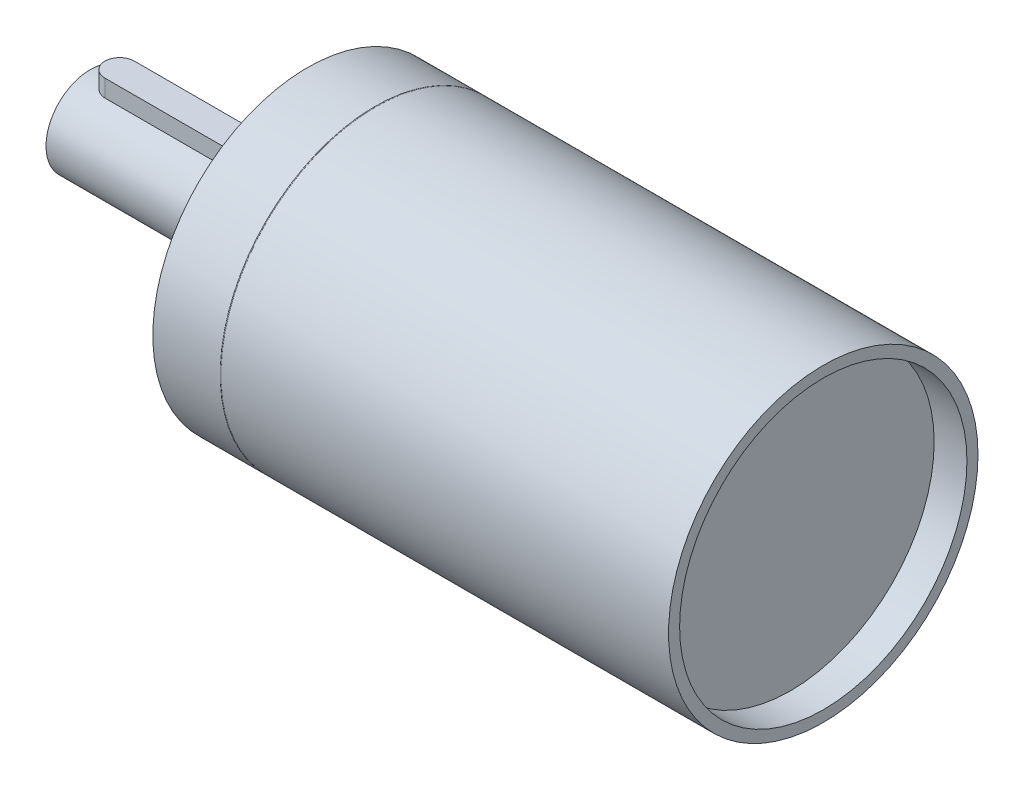
ISO-10303-21;
HEADER;
FILE_DESCRIPTION(('STEP AP214'),'2;1');
FILE_NAME('part.step','',(''),(''),'','','');
FILE_SCHEMA(('AUTOMOTIVE_DESIGN { 1 0 10303 214 1 1 1 1 }'));
ENDSEC;
DATA;
#1=APPLICATION_CONTEXT('core data for automotive mechanical design processes');
#2=APPLICATION_PROTOCOL_DEFINITION('international standard','automotive_design',2000,#1);
#3=PRODUCT_CONTEXT('',#1,'mechanical');
#4=PRODUCT('Part','Part','',(#3));
#5=PRODUCT_RELATED_PRODUCT_CATEGORY('part','',(#4));
#6=PRODUCT_DEFINITION_FORMATION('','',#4);
#7=PRODUCT_DEFINITION_CONTEXT('part definition',#1,'design');
#8=PRODUCT_DEFINITION('design','',#6,#7);
#9=PRODUCT_DEFINITION_SHAPE('','',#8);
#10=(LENGTH_UNIT() NAMED_UNIT(*) SI_UNIT(.MILLI.,.METRE.));
#11=(NAMED_UNIT(*) PLANE_ANGLE_UNIT() SI_UNIT($,.RADIAN.));
#12=(NAMED_UNIT(*) SI_UNIT($,.STERADIAN.) SOLID_ANGLE_UNIT());
#13=UNCERTAINTY_MEASURE_WITH_UNIT(LENGTH_MEASURE(1.E-05),#10,'distance_accuracy_value','');
#14=(GEOMETRIC_REPRESENTATION_CONTEXT(3) GLOBAL_UNCERTAINTY_ASSIGNED_CONTEXT((#13)) GLOBAL_UNIT_ASSIGNED_CONTEXT((#10,
#11,#12)) REPRESENTATION_CONTEXT('',''));
#15=CARTESIAN_POINT('',(0.,0.,0.));
#16=DIRECTION('',(0.,0.,1.));
#17=DIRECTION('',(1.,0.,0.));
#18=AXIS2_PLACEMENT_3D('',#15,#16,#17);
#19=CARTESIAN_POINT('',(-3.,0.,0.));
#20=DIRECTION('',(-1.,0.,0.));
#21=DIRECTION('',(0.,0.,1.));
#22=AXIS2_PLACEMENT_3D('',#19,#20,#21);
#23=PLANE('',#22);
#24=CARTESIAN_POINT('',(-3.,0.,0.));
#25=DIRECTION('',(-1.,0.,0.));
#26=DIRECTION('',(0.,0.,1.));
#27=AXIS2_PLACEMENT_3D('',#24,#25,#26);
#28=CIRCLE('',#27,14.);
#29=CARTESIAN_POINT('',(-3.,0.,14.));
#30=VERTEX_POINT('',#29);
#31=EDGE_CURVE('E270',#30,#30,#28,.T.);
#32=ORIENTED_EDGE('',*,*,#31,.T.);
#33=EDGE_LOOP('',(#32));
#34=FACE_BOUND('',#33,.T.);
#35=CARTESIAN_POINT('',(-3.,0.,0.));
#36=DIRECTION('',(-1.,0.,0.));
#37=DIRECTION('',(0.,0.,1.));
#38=AXIS2_PLACEMENT_3D('',#35,#36,#37);
#39=CIRCLE('',#38,6.);
#40=CARTESIAN_POINT('',(-3.,-5.99279677762809,-0.293916284085004));
#41=VERTEX_POINT('',#40);
#42=CARTESIAN_POINT('',(-3.,-5.99279677762809,0.293916284085002));
#43=VERTEX_POINT('',#42);
#44=EDGE_CURVE('E263',#41,#43,#39,.T.);
#45=ORIENTED_EDGE('',*,*,#44,.F.);
#46=DIRECTION('',(0.,1.,0.));
#47=VECTOR('',#46,1.);
#48=CARTESIAN_POINT('',(-3.,-5.99279677762809,-0.293916284085001));
#49=LINE('',#48,#47);
#50=CARTESIAN_POINT('',(-3.,-7.61683878137723,-0.293916284085002));
#51=VERTEX_POINT('',#50);
#52=EDGE_CURVE('E57',#51,#41,#49,.T.);
#53=ORIENTED_EDGE('',*,*,#52,.F.);
#54=CARTESIAN_POINT('',(-3.,-3.80484548733086,0.293916284084806));
#55=DIRECTION('',(-1.,0.,0.));
#56=DIRECTION('',(0.,0.,-1.));
#57=AXIS2_PLACEMENT_3D('',#54,#55,#56);
#58=CIRCLE('',#57,3.85705068699591);
#59=CARTESIAN_POINT('',(-3.,-5.99279677762799,-2.8825139690992));
#60=VERTEX_POINT('',#59);
#61=EDGE_CURVE('E242',#60,#51,#58,.T.);
#62=ORIENTED_EDGE('',*,*,#61,.F.);
#63=CARTESIAN_POINT('',(-3.,0.,0.));
#64=DIRECTION('',(-1.,0.,0.));
#65=DIRECTION('',(0.,0.,-1.));
#66=AXIS2_PLACEMENT_3D('',#63,#64,#65);
#67=CIRCLE('',#66,6.65000000000003);
#68=CARTESIAN_POINT('',(-3.,-5.99279677762799,2.88251396909925));
#69=VERTEX_POINT('',#68);
#70=EDGE_CURVE('E239',#69,#60,#67,.T.);
#71=ORIENTED_EDGE('',*,*,#70,.F.);
#72=CARTESIAN_POINT('',(-3.,-4.741805259079,0.293916284085));
#73=DIRECTION('',(-1.,0.,0.));
#74=DIRECTION('',(0.,0.,-1.));
#75=AXIS2_PLACEMENT_3D('',#72,#73,#74);
#76=CIRCLE('',#75,2.87503352229894);
#77=CARTESIAN_POINT('',(-3.,-7.616838781378,0.293916284085));
#78=VERTEX_POINT('',#77);
#79=EDGE_CURVE('E219',#78,#69,#76,.T.);
#80=ORIENTED_EDGE('',*,*,#79,.F.);
#81=DIRECTION('',(0.,-1.,0.));
#82=VECTOR('',#81,1.);
#83=CARTESIAN_POINT('',(-3.,-7.616838781378,0.293916284085));
#84=LINE('',#83,#82);
#85=EDGE_CURVE('E224',#43,#78,#84,.T.);
#86=ORIENTED_EDGE('',*,*,#85,.F.);
#87=EDGE_LOOP('',(#45,#53,#62,#71,#80,#86));
#88=FACE_BOUND('',#87,.T.);
#89=ADVANCED_FACE('F34',(#34,#88),#23,.T.);
#90=CARTESIAN_POINT('',(-29.5,0.,0.));
#91=DIRECTION('',(1.,0.,0.));
#92=DIRECTION('',(0.,0.,-1.));
#93=AXIS2_PLACEMENT_3D('',#90,#91,#92);
#94=CYLINDRICAL_SURFACE('',#93,6.);
#95=CARTESIAN_POINT('',(-25.5,5.65685424949238,-2.));
#96=CARTESIAN_POINT('',(-25.5545809936014,5.65684884188678,-2.00000149491839));
#97=CARTESIAN_POINT('',(-25.609134124377,5.65764519886488,-1.99776424917485));
#98=CARTESIAN_POINT('',(-25.7178171681065,5.6607865457843,-1.98885121407314));
#99=CARTESIAN_POINT('',(-25.7719471913153,5.66313111768225,-1.98217662286759));
#100=CARTESIAN_POINT('',(-25.9327842863838,5.67238184449255,-1.95562135046292));
#101=CARTESIAN_POINT('',(-26.038361692533,5.68150584998957,-1.92920846605835));
#102=CARTESIAN_POINT('',(-26.2432503848768,5.7045614939758,-1.85991682366505));
#103=CARTESIAN_POINT('',(-26.3425650937338,5.71849047905682,-1.81704715198057));
#104=CARTESIAN_POINT('',(-26.5326796679966,5.74957574438665,-1.71614645793826));
#105=CARTESIAN_POINT('',(-26.6234742581194,5.76673400455919,-1.65810612565572));
#106=CARTESIAN_POINT('',(-26.7974404626327,5.8030896080373,-1.52610278705983));
#107=CARTESIAN_POINT('',(-26.8802297609087,5.82233755536227,-1.45164996065965));
#108=CARTESIAN_POINT('',(-27.0324120355671,5.86027697385529,-1.28997688600225));
#109=CARTESIAN_POINT('',(-27.1018026264959,5.87896834543268,-1.20275436913029));
#110=CARTESIAN_POINT('',(-27.2269590375944,5.91427765988044,-1.01520729193638));
#111=CARTESIAN_POINT('',(-27.282321968792,5.93082875123331,-0.914600178741394));
#112=CARTESIAN_POINT('',(-27.3751845033651,5.95939217209018,-0.704858499956938));
#113=CARTESIAN_POINT('',(-27.4126895636329,5.97140588786365,-0.59572655121233));
#114=CARTESIAN_POINT('',(-27.4674714521782,5.98918142285694,-0.376058690980467));
#115=CARTESIAN_POINT('',(-27.4854065451044,5.99514617977048,-0.2657036689432));
#116=CARTESIAN_POINT('',(-27.5026325970509,6.00087216807622,-0.043397938931219));
#117=CARTESIAN_POINT('',(-27.5019279985402,6.00063487762629,0.0685523824725983));
#118=CARTESIAN_POINT('',(-27.4823114337889,5.99412077270604,0.286207690544368));
#119=CARTESIAN_POINT('',(-27.4641147240836,5.98808121982612,0.39198540523873));
#120=CARTESIAN_POINT('',(-27.4112136026545,5.97093921001734,0.598888128745041));
#121=CARTESIAN_POINT('',(-27.3765082755899,5.95983647235539,0.700012879226655));
#122=CARTESIAN_POINT('',(-27.2911572608002,5.93351336542653,0.896305246059151));
#123=CARTESIAN_POINT('',(-27.2403079097561,5.91824075676648,0.99137701130673));
#124=CARTESIAN_POINT('',(-27.1242800972176,5.8851677536006,1.17184917819647));
#125=CARTESIAN_POINT('',(-27.0590977379049,5.8673666719513,1.25724693943209));
#126=CARTESIAN_POINT('',(-26.9126579000021,5.83012543885376,1.4201946794267));
#127=CARTESIAN_POINT('',(-26.8307889127754,5.81064757359708,1.49718722323007));
#128=CARTESIAN_POINT('',(-26.6551170205604,5.77294980945556,1.63654404964595));
#129=CARTESIAN_POINT('',(-26.5613102751852,5.7547303183135,1.69890360637291));
#130=CARTESIAN_POINT('',(-26.362639643284,5.72140062752492,1.80800665119006));
#131=CARTESIAN_POINT('',(-26.2576329701248,5.70634029896345,1.85450601901916));
#132=CARTESIAN_POINT('',(-26.0407060448111,5.68162194123993,1.92892046140472));
#133=CARTESIAN_POINT('',(-25.928797013247,5.6719553881792,1.9568648721126));
#134=CARTESIAN_POINT('',(-25.763162726497,5.66273084189408,1.98331631256255));
#135=CARTESIAN_POINT('',(-25.7107172202859,5.66053335389184,1.98957012251079));
#136=CARTESIAN_POINT('',(-25.6055238431975,5.65759407142794,1.99790923214251));
#137=CARTESIAN_POINT('',(-25.5527764509098,5.65685039859056,1.99999991078996));
#138=CARTESIAN_POINT('',(-25.5,5.65685424949238,2.));
#139=B_SPLINE_CURVE_WITH_KNOTS('',3,(#95,#96,#97,#98,#99,#100,#101,#102,#103,#104,#105,#106,
#107,#108,#109,#110,#111,#112,#113,#114,#115,#116,#117,#118,#119,#120,#121,#122,#123,#124,#125,
#126,#127,#128,#129,#130,#131,#132,#133,#134,#135,#136,#137,#138),.UNSPECIFIED.,.F.,.F.,(4,2,2,
2,2,2,2,2,2,2,2,2,2,2,2,2,2,2,2,2,2,4),(0.,0.16363696946838,0.327229772333961,0.653162396780899,
0.978915321917404,1.30486862625031,1.64233009922933,1.97985159724683,2.32618265863475,
2.67240782239615,3.00658941452662,3.34069136059637,3.66168836930405,3.98270317816013,
4.30794037651948,4.63326613178045,4.97388108116901,5.31460588499576,5.66036059857048,
6.00556734974523,6.16399790665923,6.32222363058109),.UNSPECIFIED.);
#140=CARTESIAN_POINT('',(-25.5,5.65685424949238,-2.));
#141=VERTEX_POINT('',#140);
#142=CARTESIAN_POINT('',(-25.5,5.65685424949238,2.));
#143=VERTEX_POINT('',#142);
#144=EDGE_CURVE('E193',#141,#143,#139,.T.);
#145=ORIENTED_EDGE('',*,*,#144,.F.);
#146=DIRECTION('',(1.,0.,0.));
#147=VECTOR('',#146,1.);
#148=CARTESIAN_POINT('',(-29.5,5.65685424949238,-2.));
#149=LINE('',#148,#147);
#150=CARTESIAN_POINT('',(-9.5,5.65685424936646,-2.));
#151=VERTEX_POINT('',#150);
#152=EDGE_CURVE('E200',#151,#141,#149,.F.);
#153=ORIENTED_EDGE('',*,*,#152,.F.);
#154=CARTESIAN_POINT('',(-9.5,5.65685424949238,2.));
#155=CARTESIAN_POINT('',(-9.4454190063986,5.65684884188678,2.00000149491839));
#156=CARTESIAN_POINT('',(-9.390865875623,5.65764519886488,1.99776424917485));
#157=CARTESIAN_POINT('',(-9.2821828318935,5.6607865457843,1.98885121407314));
#158=CARTESIAN_POINT('',(-9.22805280868471,5.66313111768225,1.98217662286759));
#159=CARTESIAN_POINT('',(-9.06721571361618,5.67238184449255,1.95562135046292));
#160=CARTESIAN_POINT('',(-8.96163830746698,5.68150584998957,1.92920846605835));
#161=CARTESIAN_POINT('',(-8.7567496151232,5.7045614939758,1.85991682366505));
#162=CARTESIAN_POINT('',(-8.65743490626623,5.71849047905682,1.81704715198057));
#163=CARTESIAN_POINT('',(-8.46732033200342,5.74957574438665,1.71614645793826));
#164=CARTESIAN_POINT('',(-8.37652574188059,5.76673400455919,1.65810612565572));
#165=CARTESIAN_POINT('',(-8.20255953736728,5.8030896080373,1.52610278705983));
#166=CARTESIAN_POINT('',(-8.11977023909127,5.82233755536227,1.45164996065965));
#167=CARTESIAN_POINT('',(-7.96758796443294,5.86027697385529,1.28997688600225));
#168=CARTESIAN_POINT('',(-7.89819737350414,5.87896834543268,1.20275436913029));
#169=CARTESIAN_POINT('',(-7.77304096240561,5.91427765988044,1.01520729193638));
#170=CARTESIAN_POINT('',(-7.717678031208,5.93082875123331,0.914600178741397));
#171=CARTESIAN_POINT('',(-7.62481549663494,5.95939217209018,0.70485849995694));
#172=CARTESIAN_POINT('',(-7.58731043636705,5.97140588786365,0.595726551212332));
#173=CARTESIAN_POINT('',(-7.53252854782183,5.98918142285694,0.376058690980469));
#174=CARTESIAN_POINT('',(-7.51459345489563,5.99514617977048,0.265703668943202));
#175=CARTESIAN_POINT('',(-7.49736740294913,6.00087216807622,0.0433979389312211));
#176=CARTESIAN_POINT('',(-7.49807200145979,6.00063487762629,-0.0685523824725961));
#177=CARTESIAN_POINT('',(-7.51768856621112,5.99412077270604,-0.286207690544366));
#178=CARTESIAN_POINT('',(-7.53588527591636,5.98808121982612,-0.391985405238728));
#179=CARTESIAN_POINT('',(-7.58878639734554,5.97093921001734,-0.598888128745039));
#180=CARTESIAN_POINT('',(-7.62349172441006,5.95983647235539,-0.700012879226653));
#181=CARTESIAN_POINT('',(-7.70884273919977,5.93351336542653,-0.896305246059149));
#182=CARTESIAN_POINT('',(-7.75969209024387,5.91824075676648,-0.99137701130673));
#183=CARTESIAN_POINT('',(-7.87571990278237,5.88516775360061,-1.17184917819647));
#184=CARTESIAN_POINT('',(-7.94090226209511,5.8673666719513,-1.25724693943208));
#185=CARTESIAN_POINT('',(-8.08734209999791,5.83012543885376,-1.4201946794267));
#186=CARTESIAN_POINT('',(-8.16921108722459,5.81064757359708,-1.49718722323007));
#187=CARTESIAN_POINT('',(-8.34488297943958,5.77294980945556,-1.63654404964595));
#188=CARTESIAN_POINT('',(-8.43868972481484,5.7547303183135,-1.69890360637291));
#189=CARTESIAN_POINT('',(-8.63736035671603,5.72140062752492,-1.80800665119006));
#190=CARTESIAN_POINT('',(-8.74236702987523,5.70634029896345,-1.85450601901916));
#191=CARTESIAN_POINT('',(-8.95929395518887,5.68162194123993,-1.92892046140472));
#192=CARTESIAN_POINT('',(-9.071202986753,5.6719553881792,-1.9568648721126));
#193=CARTESIAN_POINT('',(-9.23683727350299,5.66273084189408,-1.98331631256255));
#194=CARTESIAN_POINT('',(-9.28928277971409,5.66053335389184,-1.98957012251079));
#195=CARTESIAN_POINT('',(-9.39447615680245,5.65759407142794,-1.99790923214251));
#196=CARTESIAN_POINT('',(-9.44722354909022,5.65685039859056,-1.99999991078996));
#197=CARTESIAN_POINT('',(-9.5,5.65685424949238,-2.));
#198=B_SPLINE_CURVE_WITH_KNOTS('',3,(#154,#155,#156,#157,#158,#159,#160,#161,#162,#163,#164,
#165,#166,#167,#168,#169,#170,#171,#172,#173,#174,#175,#176,#177,#178,#179,#180,#181,#182,#183,
#184,#185,#186,#187,#188,#189,#190,#191,#192,#193,#194,#195,#196,#197),.UNSPECIFIED.,.F.,.F.,(4,
2,2,2,2,2,2,2,2,2,2,2,2,2,2,2,2,2,2,2,2,4),(0.,0.163636969468383,0.327229772333963,
0.653162396780899,0.978915321917404,1.30486862625031,1.64233009922933,1.97985159724683,
2.32618265863475,2.67240782239615,3.00658941452662,3.34069136059637,3.66168836930405,
3.98270317816013,4.30794037651948,4.63326613178045,4.97388108116901,5.31460588499575,
5.66036059857048,6.00556734974523,6.16399790665923,6.32222363058109),.UNSPECIFIED.);
#199=CARTESIAN_POINT('',(-9.5,5.65685424936646,2.));
#200=VERTEX_POINT('',#199);
#201=EDGE_CURVE('E214',#200,#151,#198,.T.);
#202=ORIENTED_EDGE('',*,*,#201,.F.);
#203=DIRECTION('',(1.,0.,0.));
#204=VECTOR('',#203,1.);
#205=CARTESIAN_POINT('',(-29.5,5.65685424949238,2.));
#206=LINE('',#205,#204);
#207=EDGE_CURVE('E191',#143,#200,#206,.T.);
#208=ORIENTED_EDGE('',*,*,#207,.F.);
#209=EDGE_LOOP('',(#145,#153,#202,#208));
#210=FACE_BOUND('',#209,.T.);
#211=CARTESIAN_POINT('',(-29.5,0.,0.));
#212=DIRECTION('',(-1.,0.,0.));
#213=DIRECTION('',(0.,0.,1.));
#214=AXIS2_PLACEMENT_3D('',#211,#212,#213);
#215=CIRCLE('',#214,6.);
#216=CARTESIAN_POINT('',(-29.5,0.,6.));
#217=VERTEX_POINT('',#216);
#218=EDGE_CURVE('E264',#217,#217,#215,.T.);
#219=ORIENTED_EDGE('',*,*,#218,.F.);
#220=EDGE_LOOP('',(#219));
#221=FACE_BOUND('',#220,.T.);
#222=DIRECTION('',(1.,0.,0.));
#223=VECTOR('',#222,1.);
#224=CARTESIAN_POINT('',(-4.,-5.99279677762809,-0.293916284085004));
#225=LINE('',#224,#223);
#226=CARTESIAN_POINT('',(-4.,-5.99279677762809,-0.293916284085001));
#227=VERTEX_POINT('',#226);
#228=EDGE_CURVE('E252',#227,#41,#225,.T.);
#229=ORIENTED_EDGE('',*,*,#228,.T.);
#230=ORIENTED_EDGE('',*,*,#44,.T.);
#231=DIRECTION('',(1.,0.,0.));
#232=VECTOR('',#231,1.);
#233=CARTESIAN_POINT('',(-4.,-5.99279677762809,0.293916284085002));
#234=LINE('',#233,#232);
#235=CARTESIAN_POINT('',(-4.,-5.99279677762809,0.293916284085002));
#236=VERTEX_POINT('',#235);
#237=EDGE_CURVE('E249',#236,#43,#234,.T.);
#238=ORIENTED_EDGE('',*,*,#237,.F.);
#239=CARTESIAN_POINT('',(-4.,0.,0.));
#240=DIRECTION('',(1.,0.,0.));
#241=DIRECTION('',(0.,0.,1.));
#242=AXIS2_PLACEMENT_3D('',#239,#240,#241);
#243=CIRCLE('',#242,6.);
#244=EDGE_CURVE('E231',#227,#236,#243,.T.);
#245=ORIENTED_EDGE('',*,*,#244,.F.);
#246=EDGE_LOOP('',(#229,#230,#238,#245));
#247=FACE_BOUND('',#246,.T.);
#248=ADVANCED_FACE('F298',(#210,#221,#247),#94,.T.);
#249=CARTESIAN_POINT('',(0.,21.0000000000012,0.));
#250=DIRECTION('',(-1.,0.,0.));
#251=DIRECTION('',(0.,0.,1.));
#252=AXIS2_PLACEMENT_3D('',#249,#250,#251);
#253=PLANE('',#252);
#254=CARTESIAN_POINT('',(0.,17.49999999997,3.054326190989E-05));
#255=DIRECTION('',(-1.,0.,0.));
#256=DIRECTION('',(0.,0.,1.));
#257=AXIS2_PLACEMENT_3D('',#254,#255,#256);
#258=CIRCLE('',#257,1.65);
#259=CARTESIAN_POINT('',(0.,17.49999999997,1.65003054326191));
#260=VERTEX_POINT('',#259);
#261=EDGE_CURVE('E135',#260,#260,#258,.T.);
#262=ORIENTED_EDGE('',*,*,#261,.F.);
#263=EDGE_LOOP('',(#262));
#264=FACE_BOUND('',#263,.T.);
#265=CARTESIAN_POINT('',(0.,-3.054326190881E-05,17.49999999997));
#266=DIRECTION('',(-1.,0.,0.));
#267=DIRECTION('',(0.,0.,1.));
#268=AXIS2_PLACEMENT_3D('',#265,#266,#267);
#269=CIRCLE('',#268,1.65);
#270=CARTESIAN_POINT('',(0.,-3.054326190881E-05,19.14999999997));
#271=VERTEX_POINT('',#270);
#272=EDGE_CURVE('E148',#271,#271,#269,.T.);
#273=ORIENTED_EDGE('',*,*,#272,.F.);
#274=EDGE_LOOP('',(#273));
#275=FACE_BOUND('',#274,.T.);
#276=CARTESIAN_POINT('',(0.,-17.49999999997,-3.054326190774E-05));
#277=DIRECTION('',(-1.,0.,0.));
#278=DIRECTION('',(0.,0.,1.));
#279=AXIS2_PLACEMENT_3D('',#276,#277,#278);
#280=CIRCLE('',#279,1.65);
#281=CARTESIAN_POINT('',(0.,-17.49999999997,1.64996945673809));
#282=VERTEX_POINT('',#281);
#283=EDGE_CURVE('E154',#282,#282,#280,.T.);
#284=ORIENTED_EDGE('',*,*,#283,.F.);
#285=EDGE_LOOP('',(#284));
#286=FACE_BOUND('',#285,.T.);
#287=CARTESIAN_POINT('',(0.,3.054326190667E-05,-17.49999999997));
#288=DIRECTION('',(-1.,0.,0.));
#289=DIRECTION('',(0.,0.,1.));
#290=AXIS2_PLACEMENT_3D('',#287,#288,#289);
#291=CIRCLE('',#290,1.65);
#292=CARTESIAN_POINT('',(0.,3.054326190667E-05,-15.84999999997));
#293=VERTEX_POINT('',#292);
#294=EDGE_CURVE('E160',#293,#293,#291,.T.);
#295=ORIENTED_EDGE('',*,*,#294,.F.);
#296=EDGE_LOOP('',(#295));
#297=FACE_BOUND('',#296,.T.);
#298=CARTESIAN_POINT('',(0.,1.16808307098715E-12,0.));
#299=DIRECTION('',(1.,0.,0.));
#300=DIRECTION('',(0.,0.,-1.));
#301=AXIS2_PLACEMENT_3D('',#298,#299,#300);
#302=CIRCLE('',#301,21.);
#303=CARTESIAN_POINT('',(0.,1.16808307098715E-12,-21.));
#304=VERTEX_POINT('',#303);
#305=EDGE_CURVE('E273',#304,#304,#302,.T.);
#306=ORIENTED_EDGE('',*,*,#305,.F.);
#307=EDGE_LOOP('',(#306));
#308=FACE_BOUND('',#307,.T.);
#309=CARTESIAN_POINT('',(0.,0.,0.));
#310=DIRECTION('',(-1.,0.,0.));
#311=DIRECTION('',(0.,0.,1.));
#312=AXIS2_PLACEMENT_3D('',#309,#310,#311);
#313=CIRCLE('',#312,14.);
#314=CARTESIAN_POINT('',(0.,0.,14.));
#315=VERTEX_POINT('',#314);
#316=EDGE_CURVE('E267',#315,#315,#313,.T.);
#317=ORIENTED_EDGE('',*,*,#316,.F.);
#318=EDGE_LOOP('',(#317));
#319=FACE_BOUND('',#318,.T.);
#320=ADVANCED_FACE('F295',(#264,#275,#286,#297,#308,#319),#253,.T.);
#321=CARTESIAN_POINT('',(0.,1.16808307098715E-12,0.));
#322=DIRECTION('',(1.,0.,0.));
#323=DIRECTION('',(0.,0.,-1.));
#324=AXIS2_PLACEMENT_3D('',#321,#322,#323);
#325=CYLINDRICAL_SURFACE('',#324,20.9999999999999);
#326=ORIENTED_EDGE('',*,*,#305,.T.);
#327=EDGE_LOOP('',(#326));
#328=FACE_BOUND('',#327,.T.);
#329=CARTESIAN_POINT('',(9.15000000000059,1.16808307098715E-12,0.));
#330=DIRECTION('',(1.,0.,0.));
#331=DIRECTION('',(0.,0.,-1.));
#332=AXIS2_PLACEMENT_3D('',#329,#330,#331);
#333=CIRCLE('',#332,20.9999999999999);
#334=CARTESIAN_POINT('',(9.15000000000059,1.16808307098715E-12,-20.9999999999999));
#335=VERTEX_POINT('',#334);
#336=EDGE_CURVE('E11',#335,#335,#333,.T.);
#337=ORIENTED_EDGE('',*,*,#336,.F.);
#338=EDGE_LOOP('',(#337));
#339=FACE_BOUND('',#338,.T.);
#340=ADVANCED_FACE('F36',(#328,#339),#325,.T.);
#341=CARTESIAN_POINT('',(9.2,1.16920362280837E-12,0.));
#342=DIRECTION('',(1.,0.,0.));
#343=DIRECTION('',(0.,0.,-1.));
#344=AXIS2_PLACEMENT_3D('',#341,#342,#343);
#345=TOROIDAL_SURFACE('',#344,21.0866025403788,0.100000000000166);
#346=ORIENTED_EDGE('',*,*,#336,.T.);
#347=EDGE_LOOP('',(#346));
#348=FACE_BOUND('',#347,.T.);
#349=CARTESIAN_POINT('',(9.25,1.16808307098715E-12,0.));
#350=DIRECTION('',(1.,0.,0.));
#351=DIRECTION('',(0.,0.,-1.));
#352=AXIS2_PLACEMENT_3D('',#349,#350,#351);
#353=CIRCLE('',#352,21.);
#354=CARTESIAN_POINT('',(9.25,1.16808307098715E-12,-21.));
#355=VERTEX_POINT('',#354);
#356=EDGE_CURVE('E42',#355,#355,#353,.T.);
#357=ORIENTED_EDGE('',*,*,#356,.F.);
#358=EDGE_LOOP('',(#357));
#359=FACE_BOUND('',#358,.T.);
#360=ADVANCED_FACE('F286',(#348,#359),#345,.F.);
#361=CARTESIAN_POINT('',(0.,1.16808307098715E-12,0.));
#362=DIRECTION('',(1.,0.,0.));
#363=DIRECTION('',(0.,0.,-1.));
#364=AXIS2_PLACEMENT_3D('',#361,#362,#363);
#365=CYLINDRICAL_SURFACE('',#364,21.);
#366=ORIENTED_EDGE('',*,*,#356,.T.);
#367=EDGE_LOOP('',(#366));
#368=FACE_BOUND('',#367,.T.);
#369=CARTESIAN_POINT('',(70.,1.16808307098715E-12,0.));
#370=DIRECTION('',(1.,0.,0.));
#371=DIRECTION('',(0.,0.,-1.));
#372=AXIS2_PLACEMENT_3D('',#369,#370,#371);
#373=CIRCLE('',#372,21.);
#374=CARTESIAN_POINT('',(70.,1.16808307098715E-12,-21.));
#375=VERTEX_POINT('',#374);
#376=EDGE_CURVE('E278',#375,#375,#373,.T.);
#377=ORIENTED_EDGE('',*,*,#376,.F.);
#378=EDGE_LOOP('',(#377));
#379=FACE_BOUND('',#378,.T.);
#380=ADVANCED_FACE('F283',(#368,#379),#365,.T.);
#381=CARTESIAN_POINT('',(70.,1.16808307098715E-12,0.));
#382=DIRECTION('',(1.,0.,0.));
#383=DIRECTION('',(0.,0.,-1.));
#384=AXIS2_PLACEMENT_3D('',#381,#382,#383);
#385=PLANE('',#384);
#386=CARTESIAN_POINT('',(70.,0.,0.));
#387=DIRECTION('',(1.,0.,0.));
#388=DIRECTION('',(0.,0.,-1.));
#389=AXIS2_PLACEMENT_3D('',#386,#387,#388);
#390=CIRCLE('',#389,19.5);
#391=CARTESIAN_POINT('',(70.,0.,-19.5));
#392=VERTEX_POINT('',#391);
#393=EDGE_CURVE('E166',#392,#392,#390,.T.);
#394=ORIENTED_EDGE('',*,*,#393,.F.);
#395=EDGE_LOOP('',(#394));
#396=FACE_BOUND('',#395,.T.);
#397=ORIENTED_EDGE('',*,*,#376,.T.);
#398=EDGE_LOOP('',(#397));
#399=FACE_BOUND('',#398,.T.);
#400=ADVANCED_FACE('F293',(#396,#399),#385,.T.);
#401=CARTESIAN_POINT('',(-3.,0.,0.));
#402=DIRECTION('',(1.,0.,0.));
#403=DIRECTION('',(0.,0.,-1.));
#404=AXIS2_PLACEMENT_3D('',#401,#402,#403);
#405=CYLINDRICAL_SURFACE('',#404,14.);
#406=ORIENTED_EDGE('',*,*,#31,.F.);
#407=EDGE_LOOP('',(#406));
#408=FACE_BOUND('',#407,.T.);
#409=ORIENTED_EDGE('',*,*,#316,.T.);
#410=EDGE_LOOP('',(#409));
#411=FACE_BOUND('',#410,.T.);
#412=ADVANCED_FACE('F308',(#408,#411),#405,.T.);
#413=CARTESIAN_POINT('',(-29.5,0.,0.));
#414=DIRECTION('',(-1.,0.,0.));
#415=DIRECTION('',(0.,0.,1.));
#416=AXIS2_PLACEMENT_3D('',#413,#414,#415);
#417=PLANE('',#416);
#418=CARTESIAN_POINT('',(-29.5,0.,0.));
#419=DIRECTION('',(-1.,0.,0.));
#420=DIRECTION('',(0.,0.,1.));
#421=AXIS2_PLACEMENT_3D('',#418,#419,#420);
#422=CIRCLE('',#421,1.32500000000846);
#423=CARTESIAN_POINT('',(-29.5,0.,1.32500000000846));
#424=VERTEX_POINT('',#423);
#425=EDGE_CURVE('E142',#424,#424,#422,.T.);
#426=ORIENTED_EDGE('',*,*,#425,.F.);
#427=EDGE_LOOP('',(#426));
#428=FACE_BOUND('',#427,.T.);
#429=ORIENTED_EDGE('',*,*,#218,.T.);
#430=EDGE_LOOP('',(#429));
#431=FACE_BOUND('',#430,.T.);
#432=ADVANCED_FACE('F311',(#428,#431),#417,.T.);
#433=CARTESIAN_POINT('',(-4.,-4.741805259079,0.293916284085));
#434=DIRECTION('',(1.,0.,0.));
#435=DIRECTION('',(0.,0.,-1.));
#436=AXIS2_PLACEMENT_3D('',#433,#434,#435);
#437=CYLINDRICAL_SURFACE('',#436,2.87503352229894);
#438=ORIENTED_EDGE('',*,*,#79,.T.);
#439=DIRECTION('',(1.,0.,0.));
#440=VECTOR('',#439,1.);
#441=CARTESIAN_POINT('',(-4.,-5.99279677762798,2.88251396909922));
#442=LINE('',#441,#440);
#443=CARTESIAN_POINT('',(-4.,-5.99279677762798,2.88251396909922));
#444=VERTEX_POINT('',#443);
#445=EDGE_CURVE('E260',#444,#69,#442,.T.);
#446=ORIENTED_EDGE('',*,*,#445,.F.);
#447=CARTESIAN_POINT('',(-4.,-4.741805259079,0.293916284085));
#448=DIRECTION('',(-1.,0.,0.));
#449=DIRECTION('',(0.,0.,-1.));
#450=AXIS2_PLACEMENT_3D('',#447,#448,#449);
#451=CIRCLE('',#450,2.87503352229894);
#452=CARTESIAN_POINT('',(-4.,-7.616838781378,0.293916284085));
#453=VERTEX_POINT('',#452);
#454=EDGE_CURVE('E220',#453,#444,#451,.T.);
#455=ORIENTED_EDGE('',*,*,#454,.F.);
#456=DIRECTION('',(1.,0.,0.));
#457=VECTOR('',#456,1.);
#458=CARTESIAN_POINT('',(-4.,-7.616838781378,0.293916284085));
#459=LINE('',#458,#457);
#460=EDGE_CURVE('E236',#453,#78,#459,.T.);
#461=ORIENTED_EDGE('',*,*,#460,.T.);
#462=EDGE_LOOP('',(#438,#446,#455,#461));
#463=FACE_BOUND('',#462,.T.);
#464=ADVANCED_FACE('F368',(#463),#437,.T.);
#465=CARTESIAN_POINT('',(-4.,0.,0.));
#466=DIRECTION('',(1.,0.,0.));
#467=DIRECTION('',(0.,0.,-1.));
#468=AXIS2_PLACEMENT_3D('',#465,#466,#467);
#469=CYLINDRICAL_SURFACE('',#468,6.65000000000003);
#470=ORIENTED_EDGE('',*,*,#70,.T.);
#471=DIRECTION('',(1.,0.,0.));
#472=VECTOR('',#471,1.);
#473=CARTESIAN_POINT('',(-4.,-5.992796777628,-2.88251396909921));
#474=LINE('',#473,#472);
#475=CARTESIAN_POINT('',(-4.,-5.992796777628,-2.88251396909921));
#476=VERTEX_POINT('',#475);
#477=EDGE_CURVE('E257',#476,#60,#474,.T.);
#478=ORIENTED_EDGE('',*,*,#477,.F.);
#479=CARTESIAN_POINT('',(-4.,0.,0.));
#480=DIRECTION('',(-1.,0.,0.));
#481=DIRECTION('',(0.,0.,-1.));
#482=AXIS2_PLACEMENT_3D('',#479,#480,#481);
#483=CIRCLE('',#482,6.65000000000003);
#484=EDGE_CURVE('E223',#444,#476,#483,.T.);
#485=ORIENTED_EDGE('',*,*,#484,.F.);
#486=ORIENTED_EDGE('',*,*,#445,.T.);
#487=EDGE_LOOP('',(#470,#478,#485,#486));
#488=FACE_BOUND('',#487,.T.);
#489=ADVANCED_FACE('F370',(#488),#469,.T.);
#490=CARTESIAN_POINT('',(-4.,-3.80484548733086,0.293916284084806));
#491=DIRECTION('',(1.,0.,0.));
#492=DIRECTION('',(0.,0.,-1.));
#493=AXIS2_PLACEMENT_3D('',#490,#491,#492);
#494=CYLINDRICAL_SURFACE('',#493,3.85705068699591);
#495=ORIENTED_EDGE('',*,*,#61,.T.);
#496=DIRECTION('',(1.,0.,0.));
#497=VECTOR('',#496,1.);
#498=CARTESIAN_POINT('',(-4.,-7.61683878137722,-0.293916284085));
#499=LINE('',#498,#497);
#500=CARTESIAN_POINT('',(-4.,-7.61683878137722,-0.293916284085));
#501=VERTEX_POINT('',#500);
#502=EDGE_CURVE('E254',#501,#51,#499,.T.);
#503=ORIENTED_EDGE('',*,*,#502,.F.);
#504=CARTESIAN_POINT('',(-4.,-3.80484548733086,0.293916284084806));
#505=DIRECTION('',(-1.,0.,0.));
#506=DIRECTION('',(0.,0.,-1.));
#507=AXIS2_PLACEMENT_3D('',#504,#505,#506);
#508=CIRCLE('',#507,3.85705068699591);
#509=EDGE_CURVE('E226',#476,#501,#508,.T.);
#510=ORIENTED_EDGE('',*,*,#509,.F.);
#511=ORIENTED_EDGE('',*,*,#477,.T.);
#512=EDGE_LOOP('',(#495,#503,#510,#511));
#513=FACE_BOUND('',#512,.T.);
#514=ADVANCED_FACE('F374',(#513),#494,.T.);
#515=CARTESIAN_POINT('',(-4.,-5.99279677762809,-0.293916284085001));
#516=DIRECTION('',(0.,0.,-1.));
#517=DIRECTION('',(0.,1.,0.));
#518=AXIS2_PLACEMENT_3D('',#515,#516,#517);
#519=PLANE('',#518);
#520=ORIENTED_EDGE('',*,*,#52,.T.);
#521=ORIENTED_EDGE('',*,*,#228,.F.);
#522=DIRECTION('',(0.,1.,0.));
#523=VECTOR('',#522,1.);
#524=CARTESIAN_POINT('',(-4.,-5.99279677762809,-0.293916284085001));
#525=LINE('',#524,#523);
#526=EDGE_CURVE('E228',#501,#227,#525,.T.);
#527=ORIENTED_EDGE('',*,*,#526,.F.);
#528=ORIENTED_EDGE('',*,*,#502,.T.);
#529=EDGE_LOOP('',(#520,#521,#527,#528));
#530=FACE_BOUND('',#529,.T.);
#531=ADVANCED_FACE('F360',(#530),#519,.F.);
#532=CARTESIAN_POINT('',(-4.,-7.616838781378,0.293916284085));
#533=DIRECTION('',(0.,0.,1.));
#534=DIRECTION('',(0.,-1.,0.));
#535=AXIS2_PLACEMENT_3D('',#532,#533,#534);
#536=PLANE('',#535);
#537=ORIENTED_EDGE('',*,*,#85,.T.);
#538=ORIENTED_EDGE('',*,*,#460,.F.);
#539=DIRECTION('',(0.,-1.,0.));
#540=VECTOR('',#539,1.);
#541=CARTESIAN_POINT('',(-4.,-7.616838781378,0.293916284085));
#542=LINE('',#541,#540);
#543=EDGE_CURVE('E234',#236,#453,#542,.T.);
#544=ORIENTED_EDGE('',*,*,#543,.F.);
#545=ORIENTED_EDGE('',*,*,#237,.T.);
#546=EDGE_LOOP('',(#537,#538,#544,#545));
#547=FACE_BOUND('',#546,.T.);
#548=ADVANCED_FACE('F353',(#547),#536,.F.);
#549=CARTESIAN_POINT('',(-4.,-4.741805259079,0.293916284085));
#550=DIRECTION('',(1.,0.,0.));
#551=DIRECTION('',(0.,0.,-1.));
#552=AXIS2_PLACEMENT_3D('',#549,#550,#551);
#553=PLANE('',#552);
#554=ORIENTED_EDGE('',*,*,#454,.T.);
#555=ORIENTED_EDGE('',*,*,#484,.T.);
#556=ORIENTED_EDGE('',*,*,#509,.T.);
#557=ORIENTED_EDGE('',*,*,#526,.T.);
#558=ORIENTED_EDGE('',*,*,#244,.T.);
#559=ORIENTED_EDGE('',*,*,#543,.T.);
#560=EDGE_LOOP('',(#554,#555,#556,#557,#558,#559));
#561=FACE_BOUND('',#560,.T.);
#562=ADVANCED_FACE('F211',(#561),#553,.F.);
#563=CARTESIAN_POINT('',(-9.5,-500000.,-2.));
#564=DIRECTION('',(0.,0.,-1.));
#565=DIRECTION('',(-1.,0.,0.));
#566=AXIS2_PLACEMENT_3D('',#563,#564,#565);
#567=PLANE('',#566);
#568=DIRECTION('',(0.,1.,0.));
#569=VECTOR('',#568,1.);
#570=CARTESIAN_POINT('',(-9.5,-500000.,-2.));
#571=LINE('',#570,#569);
#572=CARTESIAN_POINT('',(-9.5,8.,-2.));
#573=VERTEX_POINT('',#572);
#574=EDGE_CURVE('E189',#151,#573,#571,.T.);
#575=ORIENTED_EDGE('',*,*,#574,.F.);
#576=ORIENTED_EDGE('',*,*,#152,.T.);
#577=DIRECTION('',(0.,1.,0.));
#578=VECTOR('',#577,1.);
#579=CARTESIAN_POINT('',(-25.5,-500000.,-2.));
#580=LINE('',#579,#578);
#581=CARTESIAN_POINT('',(-25.5,8.,-2.));
#582=VERTEX_POINT('',#581);
#583=EDGE_CURVE('E187',#141,#582,#580,.T.);
#584=ORIENTED_EDGE('',*,*,#583,.T.);
#585=DIRECTION('',(-1.,0.,0.));
#586=VECTOR('',#585,1.);
#587=CARTESIAN_POINT('',(-9.5,8.,-2.));
#588=LINE('',#587,#586);
#589=EDGE_CURVE('E173',#573,#582,#588,.T.);
#590=ORIENTED_EDGE('',*,*,#589,.F.);
#591=EDGE_LOOP('',(#575,#576,#584,#590));
#592=FACE_BOUND('',#591,.T.);
#593=ADVANCED_FACE('F340',(#592),#567,.T.);
#594=CARTESIAN_POINT('',(-9.5,8.,0.));
#595=DIRECTION('',(0.,1.,0.));
#596=DIRECTION('',(0.,0.,1.));
#597=AXIS2_PLACEMENT_3D('',#594,#595,#596);
#598=PLANE('',#597);
#599=CARTESIAN_POINT('',(-9.5,8.,0.));
#600=DIRECTION('',(0.,1.,0.));
#601=DIRECTION('',(0.,0.,1.));
#602=AXIS2_PLACEMENT_3D('',#599,#600,#601);
#603=CIRCLE('',#602,2.);
#604=CARTESIAN_POINT('',(-9.5,8.,2.));
#605=VERTEX_POINT('',#604);
#606=EDGE_CURVE('E172',#605,#573,#603,.T.);
#607=ORIENTED_EDGE('',*,*,#606,.T.);
#608=ORIENTED_EDGE('',*,*,#589,.T.);
#609=CARTESIAN_POINT('',(-25.5,8.,0.));
#610=DIRECTION('',(0.,1.,0.));
#611=DIRECTION('',(0.,0.,1.));
#612=AXIS2_PLACEMENT_3D('',#609,#610,#611);
#613=CIRCLE('',#612,2.);
#614=CARTESIAN_POINT('',(-25.5,8.,2.));
#615=VERTEX_POINT('',#614);
#616=EDGE_CURVE('E176',#582,#615,#613,.T.);
#617=ORIENTED_EDGE('',*,*,#616,.T.);
#618=DIRECTION('',(1.,0.,0.));
#619=VECTOR('',#618,1.);
#620=CARTESIAN_POINT('',(-25.5,8.,2.));
#621=LINE('',#620,#619);
#622=EDGE_CURVE('E179',#615,#605,#621,.T.);
#623=ORIENTED_EDGE('',*,*,#622,.T.);
#624=EDGE_LOOP('',(#607,#608,#617,#623));
#625=FACE_BOUND('',#624,.T.);
#626=ADVANCED_FACE('F344',(#625),#598,.T.);
#627=CARTESIAN_POINT('',(-9.5,-500000.,0.));
#628=DIRECTION('',(0.,1.,0.));
#629=DIRECTION('',(0.,0.,1.));
#630=AXIS2_PLACEMENT_3D('',#627,#628,#629);
#631=CYLINDRICAL_SURFACE('',#630,2.);
#632=DIRECTION('',(0.,1.,0.));
#633=VECTOR('',#632,1.);
#634=CARTESIAN_POINT('',(-9.5,-500000.,2.));
#635=LINE('',#634,#633);
#636=EDGE_CURVE('E182',#200,#605,#635,.T.);
#637=ORIENTED_EDGE('',*,*,#636,.F.);
#638=ORIENTED_EDGE('',*,*,#201,.T.);
#639=ORIENTED_EDGE('',*,*,#574,.T.);
#640=ORIENTED_EDGE('',*,*,#606,.F.);
#641=EDGE_LOOP('',(#637,#638,#639,#640));
#642=FACE_BOUND('',#641,.T.);
#643=ADVANCED_FACE('F209',(#642),#631,.T.);
#644=CARTESIAN_POINT('',(-25.5,-500000.,0.));
#645=DIRECTION('',(0.,1.,0.));
#646=DIRECTION('',(0.,0.,1.));
#647=AXIS2_PLACEMENT_3D('',#644,#645,#646);
#648=CYLINDRICAL_SURFACE('',#647,2.);
#649=ORIENTED_EDGE('',*,*,#583,.F.);
#650=ORIENTED_EDGE('',*,*,#144,.T.);
#651=DIRECTION('',(0.,1.,0.));
#652=VECTOR('',#651,1.);
#653=CARTESIAN_POINT('',(-25.5,-500000.,2.));
#654=LINE('',#653,#652);
#655=EDGE_CURVE('E49',#143,#615,#654,.T.);
#656=ORIENTED_EDGE('',*,*,#655,.T.);
#657=ORIENTED_EDGE('',*,*,#616,.F.);
#658=EDGE_LOOP('',(#649,#650,#656,#657));
#659=FACE_BOUND('',#658,.T.);
#660=ADVANCED_FACE('F202',(#659),#648,.T.);
#661=CARTESIAN_POINT('',(-25.5,-500000.,2.));
#662=DIRECTION('',(0.,0.,1.));
#663=DIRECTION('',(1.,0.,0.));
#664=AXIS2_PLACEMENT_3D('',#661,#662,#663);
#665=PLANE('',#664);
#666=ORIENTED_EDGE('',*,*,#655,.F.);
#667=ORIENTED_EDGE('',*,*,#207,.T.);
#668=ORIENTED_EDGE('',*,*,#636,.T.);
#669=ORIENTED_EDGE('',*,*,#622,.F.);
#670=EDGE_LOOP('',(#666,#667,#668,#669));
#671=FACE_BOUND('',#670,.T.);
#672=ADVANCED_FACE('F337',(#671),#665,.T.);
#673=CARTESIAN_POINT('',(65.55,0.,0.));
#674=DIRECTION('',(-1.,0.,0.));
#675=DIRECTION('',(0.,0.,1.));
#676=AXIS2_PLACEMENT_3D('',#673,#674,#675);
#677=PLANE('',#676);
#678=CARTESIAN_POINT('',(65.55,0.,0.));
#679=DIRECTION('',(1.,0.,0.));
#680=DIRECTION('',(0.,0.,-1.));
#681=AXIS2_PLACEMENT_3D('',#678,#679,#680);
#682=CIRCLE('',#681,19.5);
#683=CARTESIAN_POINT('',(65.55,0.,-19.5));
#684=VERTEX_POINT('',#683);
#685=EDGE_CURVE('E169',#684,#684,#682,.T.);
#686=ORIENTED_EDGE('',*,*,#685,.T.);
#687=EDGE_LOOP('',(#686));
#688=FACE_BOUND('',#687,.T.);
#689=ADVANCED_FACE('F327',(#688),#677,.F.);
#690=CARTESIAN_POINT('',(70.,0.,0.));
#691=DIRECTION('',(1.,0.,0.));
#692=DIRECTION('',(0.,0.,-1.));
#693=AXIS2_PLACEMENT_3D('',#690,#691,#692);
#694=CYLINDRICAL_SURFACE('',#693,19.5);
#695=ORIENTED_EDGE('',*,*,#685,.F.);
#696=EDGE_LOOP('',(#695));
#697=FACE_BOUND('',#696,.T.);
#698=ORIENTED_EDGE('',*,*,#393,.T.);
#699=EDGE_LOOP('',(#698));
#700=FACE_BOUND('',#699,.T.);
#701=ADVANCED_FACE('F324',(#697,#700),#694,.F.);
#702=CARTESIAN_POINT('',(6.00000000000001,3.054326190667E-05,-17.49999999997));
#703=DIRECTION('',(-1.,0.,0.));
#704=DIRECTION('',(0.,0.,1.));
#705=AXIS2_PLACEMENT_3D('',#702,#703,#704);
#706=CONICAL_SURFACE('',#705,1.65,1.02974425866086);
#707=CARTESIAN_POINT('',(6.99142002143094,3.054326190667E-05,-17.49999999997));
#708=VERTEX_POINT('',#707);
#709=VERTEX_LOOP('',#708);
#710=FACE_BOUND('',#709,.T.);
#711=CARTESIAN_POINT('',(6.00000000000001,3.054326190667E-05,-17.49999999997));
#712=DIRECTION('',(-1.,0.,0.));
#713=DIRECTION('',(0.,0.,1.));
#714=AXIS2_PLACEMENT_3D('',#711,#712,#713);
#715=CIRCLE('',#714,1.65);
#716=CARTESIAN_POINT('',(6.00000000000001,3.054326190667E-05,-15.84999999997));
#717=VERTEX_POINT('',#716);
#718=EDGE_CURVE('E163',#717,#717,#715,.T.);
#719=ORIENTED_EDGE('',*,*,#718,.T.);
#720=EDGE_LOOP('',(#719));
#721=FACE_BOUND('',#720,.T.);
#722=ADVANCED_FACE('F326',(#710,#721),#706,.F.);
#723=CARTESIAN_POINT('',(0.,3.054326190667E-05,-17.49999999997));
#724=DIRECTION('',(-1.,0.,0.));
#725=DIRECTION('',(0.,0.,1.));
#726=AXIS2_PLACEMENT_3D('',#723,#724,#725);
#727=CYLINDRICAL_SURFACE('',#726,1.65);
#728=ORIENTED_EDGE('',*,*,#718,.F.);
#729=EDGE_LOOP('',(#728));
#730=FACE_BOUND('',#729,.T.);
#731=ORIENTED_EDGE('',*,*,#294,.T.);
#732=EDGE_LOOP('',(#731));
#733=FACE_BOUND('',#732,.T.);
#734=ADVANCED_FACE('F334',(#730,#733),#727,.F.);
#735=CARTESIAN_POINT('',(6.00000000000001,-17.49999999997,-3.054326190774E-05));
#736=DIRECTION('',(-1.,0.,0.));
#737=DIRECTION('',(0.,0.,1.));
#738=AXIS2_PLACEMENT_3D('',#735,#736,#737);
#739=CONICAL_SURFACE('',#738,1.65,1.02974425866086);
#740=CARTESIAN_POINT('',(6.99142002143095,-17.49999999997,-3.054326190774E-05));
#741=VERTEX_POINT('',#740);
#742=VERTEX_LOOP('',#741);
#743=FACE_BOUND('',#742,.T.);
#744=CARTESIAN_POINT('',(6.00000000000001,-17.49999999997,-3.054326190774E-05));
#745=DIRECTION('',(-1.,0.,0.));
#746=DIRECTION('',(0.,0.,1.));
#747=AXIS2_PLACEMENT_3D('',#744,#745,#746);
#748=CIRCLE('',#747,1.65);
#749=CARTESIAN_POINT('',(6.00000000000001,-17.49999999997,1.64996945673809));
#750=VERTEX_POINT('',#749);
#751=EDGE_CURVE('E157',#750,#750,#748,.T.);
#752=ORIENTED_EDGE('',*,*,#751,.T.);
#753=EDGE_LOOP('',(#752));
#754=FACE_BOUND('',#753,.T.);
#755=ADVANCED_FACE('F427',(#743,#754),#739,.F.);
#756=CARTESIAN_POINT('',(0.,-17.49999999997,-3.054326190774E-05));
#757=DIRECTION('',(-1.,0.,0.));
#758=DIRECTION('',(0.,0.,1.));
#759=AXIS2_PLACEMENT_3D('',#756,#757,#758);
#760=CYLINDRICAL_SURFACE('',#759,1.65);
#761=ORIENTED_EDGE('',*,*,#751,.F.);
#762=EDGE_LOOP('',(#761));
#763=FACE_BOUND('',#762,.T.);
#764=ORIENTED_EDGE('',*,*,#283,.T.);
#765=EDGE_LOOP('',(#764));
#766=FACE_BOUND('',#765,.T.);
#767=ADVANCED_FACE('F423',(#763,#766),#760,.F.);
#768=CARTESIAN_POINT('',(6.00000000000001,-3.054326190881E-05,17.49999999997));
#769=DIRECTION('',(-1.,0.,0.));
#770=DIRECTION('',(0.,0.,1.));
#771=AXIS2_PLACEMENT_3D('',#768,#769,#770);
#772=CONICAL_SURFACE('',#771,1.65,1.02974425866086);
#773=CARTESIAN_POINT('',(6.99142002143094,-3.054326190881E-05,17.49999999997));
#774=VERTEX_POINT('',#773);
#775=VERTEX_LOOP('',#774);
#776=FACE_BOUND('',#775,.T.);
#777=CARTESIAN_POINT('',(6.00000000000001,-3.054326190881E-05,17.49999999997));
#778=DIRECTION('',(-1.,0.,0.));
#779=DIRECTION('',(0.,0.,1.));
#780=AXIS2_PLACEMENT_3D('',#777,#778,#779);
#781=CIRCLE('',#780,1.65);
#782=CARTESIAN_POINT('',(6.00000000000001,-3.054326190881E-05,19.14999999997));
#783=VERTEX_POINT('',#782);
#784=EDGE_CURVE('E151',#783,#783,#781,.T.);
#785=ORIENTED_EDGE('',*,*,#784,.T.);
#786=EDGE_LOOP('',(#785));
#787=FACE_BOUND('',#786,.T.);
#788=ADVANCED_FACE('F419',(#776,#787),#772,.F.);
#789=CARTESIAN_POINT('',(0.,-3.054326190881E-05,17.49999999997));
#790=DIRECTION('',(-1.,0.,0.));
#791=DIRECTION('',(0.,0.,1.));
#792=AXIS2_PLACEMENT_3D('',#789,#790,#791);
#793=CYLINDRICAL_SURFACE('',#792,1.65);
#794=ORIENTED_EDGE('',*,*,#784,.F.);
#795=EDGE_LOOP('',(#794));
#796=FACE_BOUND('',#795,.T.);
#797=ORIENTED_EDGE('',*,*,#272,.T.);
#798=EDGE_LOOP('',(#797));
#799=FACE_BOUND('',#798,.T.);
#800=ADVANCED_FACE('F415',(#796,#799),#793,.F.);
#801=CARTESIAN_POINT('',(6.00000000000001,17.49999999997,3.054326190989E-05));
#802=DIRECTION('',(-1.,0.,0.));
#803=DIRECTION('',(0.,0.,1.));
#804=AXIS2_PLACEMENT_3D('',#801,#802,#803);
#805=CONICAL_SURFACE('',#804,1.65,1.02974425866086);
#806=CARTESIAN_POINT('',(6.99142002143095,17.49999999997,3.054326190989E-05));
#807=VERTEX_POINT('',#806);
#808=VERTEX_LOOP('',#807);
#809=FACE_BOUND('',#808,.T.);
#810=CARTESIAN_POINT('',(6.00000000000001,17.49999999997,3.054326190989E-05));
#811=DIRECTION('',(-1.,0.,0.));
#812=DIRECTION('',(0.,0.,1.));
#813=AXIS2_PLACEMENT_3D('',#810,#811,#812);
#814=CIRCLE('',#813,1.65);
#815=CARTESIAN_POINT('',(6.00000000000001,17.49999999997,1.65003054326191));
#816=VERTEX_POINT('',#815);
#817=EDGE_CURVE('E139',#816,#816,#814,.T.);
#818=ORIENTED_EDGE('',*,*,#817,.T.);
#819=EDGE_LOOP('',(#818));
#820=FACE_BOUND('',#819,.T.);
#821=ADVANCED_FACE('F411',(#809,#820),#805,.F.);
#822=CARTESIAN_POINT('',(0.,17.49999999997,3.054326190989E-05));
#823=DIRECTION('',(-1.,0.,0.));
#824=DIRECTION('',(0.,0.,1.));
#825=AXIS2_PLACEMENT_3D('',#822,#823,#824);
#826=CYLINDRICAL_SURFACE('',#825,1.65);
#827=ORIENTED_EDGE('',*,*,#817,.F.);
#828=EDGE_LOOP('',(#827));
#829=FACE_BOUND('',#828,.T.);
#830=ORIENTED_EDGE('',*,*,#261,.T.);
#831=EDGE_LOOP('',(#830));
#832=FACE_BOUND('',#831,.T.);
#833=ADVANCED_FACE('F129',(#829,#832),#826,.F.);
#834=CARTESIAN_POINT('',(-27.5608439182555,0.,0.));
#835=DIRECTION('',(-1.,0.,0.));
#836=DIRECTION('',(0.,0.,1.));
#837=AXIS2_PLACEMENT_3D('',#834,#835,#836);
#838=CONICAL_SURFACE('',#837,0.625000000013642,1.04719755117749);
#839=CARTESIAN_POINT('',(-27.1999999999881,0.,0.));
#840=VERTEX_POINT('',#839);
#841=VERTEX_LOOP('',#840);
#842=FACE_BOUND('',#841,.T.);
#843=CARTESIAN_POINT('',(-27.5608439182555,0.,0.));
#844=DIRECTION('',(-1.,0.,0.));
#845=DIRECTION('',(0.,0.,1.));
#846=AXIS2_PLACEMENT_3D('',#843,#844,#845);
#847=CIRCLE('',#846,0.625000000013642);
#848=CARTESIAN_POINT('',(-27.5608439182555,0.,0.625000000013642));
#849=VERTEX_POINT('',#848);
#850=EDGE_CURVE('E133',#849,#849,#847,.T.);
#851=ORIENTED_EDGE('',*,*,#850,.T.);
#852=EDGE_LOOP('',(#851));
#853=FACE_BOUND('',#852,.T.);
#854=ADVANCED_FACE('F125',(#842,#853),#838,.F.);
#855=CARTESIAN_POINT('',(-29.5,0.,0.));
#856=DIRECTION('',(-1.,0.,0.));
#857=DIRECTION('',(0.,0.,1.));
#858=AXIS2_PLACEMENT_3D('',#855,#856,#857);
#859=CYLINDRICAL_SURFACE('',#858,0.625000000013642);
#860=ORIENTED_EDGE('',*,*,#850,.F.);
#861=EDGE_LOOP('',(#860));
#862=FACE_BOUND('',#861,.T.);
#863=CARTESIAN_POINT('',(-28.2875644346787,0.,0.));
#864=DIRECTION('',(-1.,0.,0.));
#865=DIRECTION('',(0.,0.,1.));
#866=AXIS2_PLACEMENT_3D('',#863,#864,#865);
#867=CIRCLE('',#866,0.625000000013642);
#868=CARTESIAN_POINT('',(-28.2875644346787,0.,0.625000000013642));
#869=VERTEX_POINT('',#868);
#870=EDGE_CURVE('E136',#869,#869,#867,.T.);
#871=ORIENTED_EDGE('',*,*,#870,.T.);
#872=EDGE_LOOP('',(#871));
#873=FACE_BOUND('',#872,.T.);
#874=ADVANCED_FACE('F128',(#862,#873),#859,.F.);
#875=CARTESIAN_POINT('',(-29.5,0.,0.));
#876=DIRECTION('',(-1.,0.,0.));
#877=DIRECTION('',(0.,0.,1.));
#878=AXIS2_PLACEMENT_3D('',#875,#876,#877);
#879=CONICAL_SURFACE('',#878,1.32500000000846,0.523598775586828);
#880=ORIENTED_EDGE('',*,*,#870,.F.);
#881=EDGE_LOOP('',(#880));
#882=FACE_BOUND('',#881,.T.);
#883=ORIENTED_EDGE('',*,*,#425,.T.);
#884=EDGE_LOOP('',(#883));
#885=FACE_BOUND('',#884,.T.);
#886=ADVANCED_FACE('F399',(#882,#885),#879,.F.);
#887=CLOSED_SHELL('',(#89,#248,#320,#340,#360,#380,#400,#412,#432,#464,#489,#514,#531,#548,#562,
#593,#626,#643,#660,#672,#689,#701,#722,#734,#755,#767,#788,#800,#821,#833,#854,#874,#886));
#888=MANIFOLD_SOLID_BREP('B2',#887);
#889=ADVANCED_BREP_SHAPE_REPRESENTATION('',(#18,#888),#14);
#890=SHAPE_DEFINITION_REPRESENTATION(#9,#889);
ENDSEC;
END-ISO-10303-21;
